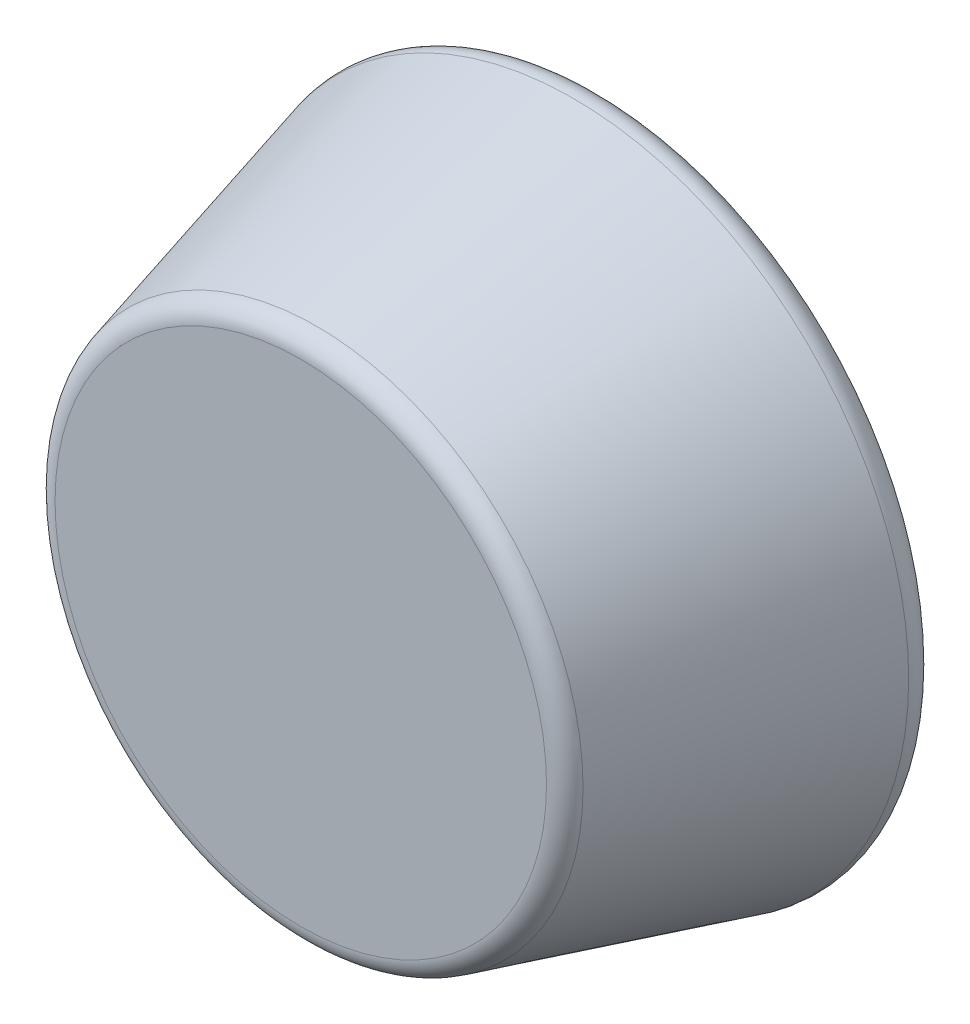
ISO-10303-21;
HEADER;
FILE_DESCRIPTION(('STEP AP214'),'2;1');
FILE_NAME('part.step','',(''),(''),'','','');
FILE_SCHEMA(('AUTOMOTIVE_DESIGN { 1 0 10303 214 1 1 1 1 }'));
ENDSEC;
DATA;
#1=APPLICATION_CONTEXT('core data for automotive mechanical design processes');
#2=APPLICATION_PROTOCOL_DEFINITION('international standard','automotive_design',2000,#1);
#3=PRODUCT_CONTEXT('',#1,'mechanical');
#4=PRODUCT('Part','Part','',(#3));
#5=PRODUCT_RELATED_PRODUCT_CATEGORY('part','',(#4));
#6=PRODUCT_DEFINITION_FORMATION('','',#4);
#7=PRODUCT_DEFINITION_CONTEXT('part definition',#1,'design');
#8=PRODUCT_DEFINITION('design','',#6,#7);
#9=PRODUCT_DEFINITION_SHAPE('','',#8);
#10=(LENGTH_UNIT() NAMED_UNIT(*) SI_UNIT(.MILLI.,.METRE.));
#11=(NAMED_UNIT(*) PLANE_ANGLE_UNIT() SI_UNIT($,.RADIAN.));
#12=(NAMED_UNIT(*) SI_UNIT($,.STERADIAN.) SOLID_ANGLE_UNIT());
#13=UNCERTAINTY_MEASURE_WITH_UNIT(LENGTH_MEASURE(1.E-05),#10,'distance_accuracy_value','');
#14=(GEOMETRIC_REPRESENTATION_CONTEXT(3) GLOBAL_UNCERTAINTY_ASSIGNED_CONTEXT((#13)) GLOBAL_UNIT_ASSIGNED_CONTEXT((#10,
#11,#12)) REPRESENTATION_CONTEXT('',''));
#15=CARTESIAN_POINT('',(0.,0.,0.));
#16=DIRECTION('',(0.,0.,1.));
#17=DIRECTION('',(1.,0.,0.));
#18=AXIS2_PLACEMENT_3D('',#15,#16,#17);
#19=CARTESIAN_POINT('',(0.,0.,-1.));
#20=DIRECTION('',(0.,0.,1.));
#21=DIRECTION('',(1.,0.,0.));
#22=AXIS2_PLACEMENT_3D('',#19,#20,#21);
#23=PLANE('',#22);
#24=CARTESIAN_POINT('',(0.,0.,-1.));
#25=DIRECTION('',(0.,0.,1.));
#26=DIRECTION('',(1.,0.,0.));
#27=AXIS2_PLACEMENT_3D('',#24,#25,#26);
#28=CIRCLE('',#27,3.5);
#29=CARTESIAN_POINT('',(3.5,0.,-1.));
#30=VERTEX_POINT('',#29);
#31=EDGE_CURVE('E58',#30,#30,#28,.T.);
#32=ORIENTED_EDGE('',*,*,#31,.F.);
#33=EDGE_LOOP('',(#32));
#34=FACE_BOUND('',#33,.T.);
#35=ADVANCED_FACE('F15',(#34),#23,.F.);
#36=CARTESIAN_POINT('',(0.,0.,-1.));
#37=DIRECTION('',(0.,0.,1.));
#38=DIRECTION('',(1.,0.,0.));
#39=AXIS2_PLACEMENT_3D('',#36,#37,#38);
#40=CYLINDRICAL_SURFACE('',#39,3.5);
#41=CARTESIAN_POINT('',(0.,0.,1.));
#42=DIRECTION('',(0.,0.,1.));
#43=DIRECTION('',(1.,0.,0.));
#44=AXIS2_PLACEMENT_3D('',#41,#42,#43);
#45=CIRCLE('',#44,3.5);
#46=CARTESIAN_POINT('',(3.5,0.,1.));
#47=VERTEX_POINT('',#46);
#48=EDGE_CURVE('E51',#47,#47,#45,.F.);
#49=ORIENTED_EDGE('',*,*,#48,.T.);
#50=EDGE_LOOP('',(#49));
#51=FACE_BOUND('',#50,.T.);
#52=ORIENTED_EDGE('',*,*,#31,.T.);
#53=EDGE_LOOP('',(#52));
#54=FACE_BOUND('',#53,.T.);
#55=ADVANCED_FACE('F148',(#51,#54),#40,.T.);
#56=CARTESIAN_POINT('',(0.,0.,1.));
#57=DIRECTION('',(0.,0.,1.));
#58=DIRECTION('',(1.,0.,0.));
#59=AXIS2_PLACEMENT_3D('',#56,#57,#58);
#60=PLANE('',#59);
#61=ORIENTED_EDGE('',*,*,#48,.F.);
#62=EDGE_LOOP('',(#61));
#63=FACE_BOUND('',#62,.T.);
#64=CARTESIAN_POINT('',(0.,0.,1.));
#65=DIRECTION('',(0.,0.,1.));
#66=DIRECTION('',(-1.,0.,0.));
#67=AXIS2_PLACEMENT_3D('',#64,#65,#66);
#68=CIRCLE('',#67,7.3483873135794);
#69=CARTESIAN_POINT('',(-7.3483873135794,0.,1.));
#70=VERTEX_POINT('',#69);
#71=CARTESIAN_POINT('',(7.3483873135794,0.,1.));
#72=VERTEX_POINT('',#71);
#73=EDGE_CURVE('E43',#70,#72,#68,.T.);
#74=ORIENTED_EDGE('',*,*,#73,.F.);
#75=CARTESIAN_POINT('',(0.,0.,1.));
#76=DIRECTION('',(0.,0.,1.));
#77=DIRECTION('',(1.,0.,0.));
#78=AXIS2_PLACEMENT_3D('',#75,#76,#77);
#79=CIRCLE('',#78,7.3483873135794);
#80=EDGE_CURVE('E49',#72,#70,#79,.T.);
#81=ORIENTED_EDGE('',*,*,#80,.F.);
#82=EDGE_LOOP('',(#74,#81));
#83=FACE_BOUND('',#82,.T.);
#84=ADVANCED_FACE('F48',(#63,#83),#60,.F.);
#85=CARTESIAN_POINT('',(0.,0.,8.));
#86=DIRECTION('',(0.,0.,1.));
#87=DIRECTION('',(1.,0.,0.));
#88=AXIS2_PLACEMENT_3D('',#85,#86,#87);
#89=PLANE('',#88);
#90=CARTESIAN_POINT('',(0.,0.,8.));
#91=DIRECTION('',(0.,0.,-1.));
#92=DIRECTION('',(1.,0.,0.));
#93=AXIS2_PLACEMENT_3D('',#90,#91,#92);
#94=CIRCLE('',#93,5.74069215899266);
#95=CARTESIAN_POINT('',(-5.74069215899266,0.,8.));
#96=VERTEX_POINT('',#95);
#97=CARTESIAN_POINT('',(5.74069215899266,0.,8.));
#98=VERTEX_POINT('',#97);
#99=EDGE_CURVE('E34',#96,#98,#94,.F.);
#100=ORIENTED_EDGE('',*,*,#99,.T.);
#101=CARTESIAN_POINT('',(0.,0.,8.));
#102=DIRECTION('',(0.,0.,-1.));
#103=DIRECTION('',(-1.,0.,0.));
#104=AXIS2_PLACEMENT_3D('',#101,#102,#103);
#105=CIRCLE('',#104,5.74069215899266);
#106=EDGE_CURVE('E94',#96,#98,#105,.T.);
#107=ORIENTED_EDGE('',*,*,#106,.F.);
#108=EDGE_LOOP('',(#100,#107));
#109=FACE_BOUND('',#108,.T.);
#110=ADVANCED_FACE('F74',(#109),#89,.T.);
#111=CARTESIAN_POINT('',(0.,0.,1.5));
#112=DIRECTION('',(0.,0.,1.));
#113=DIRECTION('',(1.,0.,0.));
#114=AXIS2_PLACEMENT_3D('',#111,#112,#113);
#115=TOROIDAL_SURFACE('',#114,7.3483873135794,0.5);
#116=ORIENTED_EDGE('',*,*,#73,.T.);
#117=ORIENTED_EDGE('',*,*,#80,.T.);
#118=EDGE_LOOP('',(#116,#117));
#119=FACE_BOUND('',#118,.T.);
#120=CARTESIAN_POINT('',(0.,0.,1.62940952260171));
#121=DIRECTION('',(0.,0.,-1.));
#122=DIRECTION('',(1.,0.,0.));
#123=AXIS2_PLACEMENT_3D('',#120,#121,#122);
#124=CIRCLE('',#123,7.83135022691222);
#125=CARTESIAN_POINT('',(7.83135022691222,0.,1.62940952260171));
#126=VERTEX_POINT('',#125);
#127=EDGE_CURVE('E26',#126,#126,#124,.F.);
#128=ORIENTED_EDGE('',*,*,#127,.F.);
#129=EDGE_LOOP('',(#128));
#130=FACE_BOUND('',#129,.T.);
#131=ADVANCED_FACE('F54',(#119,#130),#115,.T.);
#132=CARTESIAN_POINT('',(0.,0.,7.5));
#133=DIRECTION('',(0.,0.,-1.));
#134=DIRECTION('',(-1.,0.,0.));
#135=AXIS2_PLACEMENT_3D('',#132,#133,#134);
#136=TOROIDAL_SURFACE('',#135,5.74069215899266,0.5);
#137=CARTESIAN_POINT('',(0.,0.,7.62940952308265));
#138=DIRECTION('',(0.,0.,-1.));
#139=DIRECTION('',(1.,0.,0.));
#140=AXIS2_PLACEMENT_3D('',#137,#138,#139);
#141=CIRCLE('',#140,6.22365507412038);
#142=CARTESIAN_POINT('',(6.22365507412038,0.,7.62940952308265));
#143=VERTEX_POINT('',#142);
#144=EDGE_CURVE('E10',#143,#143,#141,.T.);
#145=ORIENTED_EDGE('',*,*,#144,.F.);
#146=EDGE_LOOP('',(#145));
#147=FACE_BOUND('',#146,.T.);
#148=ORIENTED_EDGE('',*,*,#106,.T.);
#149=ORIENTED_EDGE('',*,*,#99,.F.);
#150=EDGE_LOOP('',(#148,#149));
#151=FACE_BOUND('',#150,.T.);
#152=ADVANCED_FACE('F73',(#147,#151),#136,.T.);
#153=CARTESIAN_POINT('',(0.,0.,1.62940952260171));
#154=DIRECTION('',(0.,0.,-1.));
#155=DIRECTION('',(0.,1.,0.));
#156=AXIS2_PLACEMENT_3D('',#153,#154,#155);
#157=CONICAL_SURFACE('',#156,7.83135022691222,0.2617993875);
#158=ORIENTED_EDGE('',*,*,#127,.T.);
#159=EDGE_LOOP('',(#158));
#160=FACE_BOUND('',#159,.T.);
#161=ORIENTED_EDGE('',*,*,#144,.T.);
#162=EDGE_LOOP('',(#161));
#163=FACE_BOUND('',#162,.T.);
#164=ADVANCED_FACE('F115',(#160,#163),#157,.T.);
#165=CLOSED_SHELL('',(#35,#55,#84,#110,#131,#152,#164));
#166=MANIFOLD_SOLID_BREP('B1',#165);
#167=ADVANCED_BREP_SHAPE_REPRESENTATION('',(#18,#166),#14);
#168=SHAPE_DEFINITION_REPRESENTATION(#9,#167);
ENDSEC;
END-ISO-10303-21;
